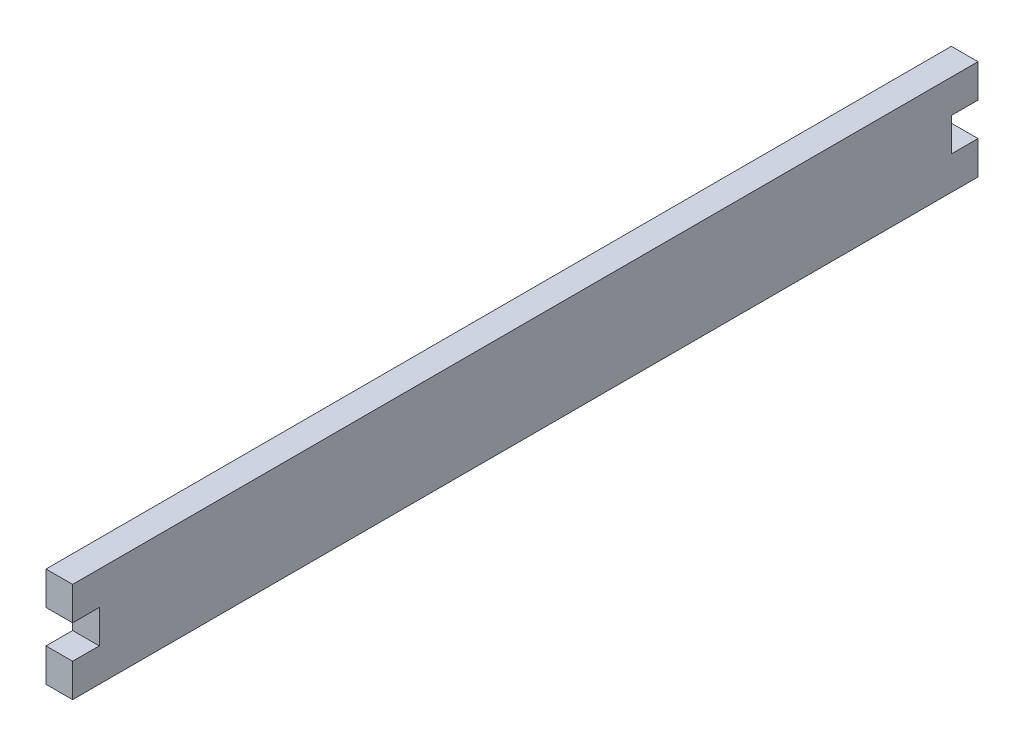
ISO-10303-21;
HEADER;
FILE_DESCRIPTION(('STEP AP214'),'2;1');
FILE_NAME('part.step','',(''),(''),'','','');
FILE_SCHEMA(('AUTOMOTIVE_DESIGN { 1 0 10303 214 1 1 1 1 }'));
ENDSEC;
DATA;
#1=APPLICATION_CONTEXT('core data for automotive mechanical design processes');
#2=APPLICATION_PROTOCOL_DEFINITION('international standard','automotive_design',2000,#1);
#3=PRODUCT_CONTEXT('',#1,'mechanical');
#4=PRODUCT('Part','Part','',(#3));
#5=PRODUCT_RELATED_PRODUCT_CATEGORY('part','',(#4));
#6=PRODUCT_DEFINITION_FORMATION('','',#4);
#7=PRODUCT_DEFINITION_CONTEXT('part definition',#1,'design');
#8=PRODUCT_DEFINITION('design','',#6,#7);
#9=PRODUCT_DEFINITION_SHAPE('','',#8);
#10=(LENGTH_UNIT() NAMED_UNIT(*) SI_UNIT(.MILLI.,.METRE.));
#11=(NAMED_UNIT(*) PLANE_ANGLE_UNIT() SI_UNIT($,.RADIAN.));
#12=(NAMED_UNIT(*) SI_UNIT($,.STERADIAN.) SOLID_ANGLE_UNIT());
#13=UNCERTAINTY_MEASURE_WITH_UNIT(LENGTH_MEASURE(1.E-05),#10,'distance_accuracy_value','');
#14=(GEOMETRIC_REPRESENTATION_CONTEXT(3) GLOBAL_UNCERTAINTY_ASSIGNED_CONTEXT((#13)) GLOBAL_UNIT_ASSIGNED_CONTEXT((#10,
#11,#12)) REPRESENTATION_CONTEXT('',''));
#15=CARTESIAN_POINT('',(0.,0.,0.));
#16=DIRECTION('',(0.,0.,1.));
#17=DIRECTION('',(1.,0.,0.));
#18=AXIS2_PLACEMENT_3D('',#15,#16,#17);
#19=CARTESIAN_POINT('',(3.175,0.,0.));
#20=DIRECTION('',(0.,0.,-1.));
#21=DIRECTION('',(-1.,0.,0.));
#22=AXIS2_PLACEMENT_3D('',#19,#20,#21);
#23=PLANE('',#22);
#24=DIRECTION('',(0.,-1.,0.));
#25=VECTOR('',#24,1.);
#26=CARTESIAN_POINT('',(0.,0.,0.));
#27=LINE('',#26,#25);
#28=CARTESIAN_POINT('',(0.,3.96875,0.));
#29=VERTEX_POINT('',#28);
#30=CARTESIAN_POINT('',(0.,0.,0.));
#31=VERTEX_POINT('',#30);
#32=EDGE_CURVE('E153',#29,#31,#27,.T.);
#33=ORIENTED_EDGE('',*,*,#32,.T.);
#34=DIRECTION('',(-1.,0.,0.));
#35=VECTOR('',#34,1.);
#36=CARTESIAN_POINT('',(3.175,0.,0.));
#37=LINE('',#36,#35);
#38=CARTESIAN_POINT('',(3.175,0.,0.));
#39=VERTEX_POINT('',#38);
#40=EDGE_CURVE('E11',#39,#31,#37,.T.);
#41=ORIENTED_EDGE('',*,*,#40,.F.);
#42=DIRECTION('',(0.,-1.,0.));
#43=VECTOR('',#42,1.);
#44=CARTESIAN_POINT('',(3.175,0.,0.));
#45=LINE('',#44,#43);
#46=CARTESIAN_POINT('',(3.175,3.96875,0.));
#47=VERTEX_POINT('',#46);
#48=EDGE_CURVE('E175',#47,#39,#45,.T.);
#49=ORIENTED_EDGE('',*,*,#48,.F.);
#50=DIRECTION('',(-1.,0.,0.));
#51=VECTOR('',#50,1.);
#52=CARTESIAN_POINT('',(3.175,3.96875,0.));
#53=LINE('',#52,#51);
#54=EDGE_CURVE('E149',#47,#29,#53,.T.);
#55=ORIENTED_EDGE('',*,*,#54,.T.);
#56=EDGE_LOOP('',(#33,#41,#49,#55));
#57=FACE_BOUND('',#56,.T.);
#58=ADVANCED_FACE('F33',(#57),#23,.F.);
#59=CARTESIAN_POINT('',(3.175,0.,0.));
#60=DIRECTION('',(0.,1.,0.));
#61=DIRECTION('',(0.,0.,1.));
#62=AXIS2_PLACEMENT_3D('',#59,#60,#61);
#63=PLANE('',#62);
#64=DIRECTION('',(0.,0.,-1.));
#65=VECTOR('',#64,1.);
#66=CARTESIAN_POINT('',(0.,0.,0.));
#67=LINE('',#66,#65);
#68=CARTESIAN_POINT('',(0.,0.,-107.95));
#69=VERTEX_POINT('',#68);
#70=EDGE_CURVE('E156',#31,#69,#67,.T.);
#71=ORIENTED_EDGE('',*,*,#70,.T.);
#72=DIRECTION('',(-1.,0.,0.));
#73=VECTOR('',#72,1.);
#74=CARTESIAN_POINT('',(3.175,0.,-107.95));
#75=LINE('',#74,#73);
#76=CARTESIAN_POINT('',(3.175,0.,-107.95));
#77=VERTEX_POINT('',#76);
#78=EDGE_CURVE('E41',#77,#69,#75,.T.);
#79=ORIENTED_EDGE('',*,*,#78,.F.);
#80=DIRECTION('',(0.,0.,-1.));
#81=VECTOR('',#80,1.);
#82=CARTESIAN_POINT('',(3.175,0.,0.));
#83=LINE('',#82,#81);
#84=EDGE_CURVE('E104',#39,#77,#83,.T.);
#85=ORIENTED_EDGE('',*,*,#84,.F.);
#86=ORIENTED_EDGE('',*,*,#40,.T.);
#87=EDGE_LOOP('',(#71,#79,#85,#86));
#88=FACE_BOUND('',#87,.T.);
#89=ADVANCED_FACE('F253',(#88),#63,.F.);
#90=CARTESIAN_POINT('',(3.175,0.,-107.95));
#91=DIRECTION('',(0.,0.,1.));
#92=DIRECTION('',(1.,0.,0.));
#93=AXIS2_PLACEMENT_3D('',#90,#91,#92);
#94=PLANE('',#93);
#95=DIRECTION('',(0.,1.,0.));
#96=VECTOR('',#95,1.);
#97=CARTESIAN_POINT('',(0.,0.,-107.95));
#98=LINE('',#97,#96);
#99=CARTESIAN_POINT('',(0.,3.96875,-107.95));
#100=VERTEX_POINT('',#99);
#101=EDGE_CURVE('E158',#69,#100,#98,.T.);
#102=ORIENTED_EDGE('',*,*,#101,.T.);
#103=DIRECTION('',(-1.,0.,0.));
#104=VECTOR('',#103,1.);
#105=CARTESIAN_POINT('',(3.175,3.96875,-107.95));
#106=LINE('',#105,#104);
#107=CARTESIAN_POINT('',(3.175,3.96875,-107.95));
#108=VERTEX_POINT('',#107);
#109=EDGE_CURVE('E194',#108,#100,#106,.T.);
#110=ORIENTED_EDGE('',*,*,#109,.F.);
#111=DIRECTION('',(0.,1.,0.));
#112=VECTOR('',#111,1.);
#113=CARTESIAN_POINT('',(3.175,0.,-107.95));
#114=LINE('',#113,#112);
#115=EDGE_CURVE('E202',#77,#108,#114,.T.);
#116=ORIENTED_EDGE('',*,*,#115,.F.);
#117=ORIENTED_EDGE('',*,*,#78,.T.);
#118=EDGE_LOOP('',(#102,#110,#116,#117));
#119=FACE_BOUND('',#118,.T.);
#120=ADVANCED_FACE('F200',(#119),#94,.F.);
#121=CARTESIAN_POINT('',(3.175,3.96875,-107.95));
#122=DIRECTION('',(0.,-1.,0.));
#123=DIRECTION('',(0.,0.,-1.));
#124=AXIS2_PLACEMENT_3D('',#121,#122,#123);
#125=PLANE('',#124);
#126=DIRECTION('',(0.,0.,1.));
#127=VECTOR('',#126,1.);
#128=CARTESIAN_POINT('',(0.,3.96875,-107.95));
#129=LINE('',#128,#127);
#130=CARTESIAN_POINT('',(0.,3.96875,-104.775));
#131=VERTEX_POINT('',#130);
#132=EDGE_CURVE('E160',#100,#131,#129,.T.);
#133=ORIENTED_EDGE('',*,*,#132,.T.);
#134=DIRECTION('',(-1.,0.,0.));
#135=VECTOR('',#134,1.);
#136=CARTESIAN_POINT('',(3.175,3.96875,-104.775));
#137=LINE('',#136,#135);
#138=CARTESIAN_POINT('',(3.175,3.96875,-104.775));
#139=VERTEX_POINT('',#138);
#140=EDGE_CURVE('E191',#139,#131,#137,.T.);
#141=ORIENTED_EDGE('',*,*,#140,.F.);
#142=DIRECTION('',(0.,0.,1.));
#143=VECTOR('',#142,1.);
#144=CARTESIAN_POINT('',(3.175,3.96875,-107.95));
#145=LINE('',#144,#143);
#146=EDGE_CURVE('E220',#108,#139,#145,.T.);
#147=ORIENTED_EDGE('',*,*,#146,.F.);
#148=ORIENTED_EDGE('',*,*,#109,.T.);
#149=EDGE_LOOP('',(#133,#141,#147,#148));
#150=FACE_BOUND('',#149,.T.);
#151=ADVANCED_FACE('F211',(#150),#125,.F.);
#152=CARTESIAN_POINT('',(3.175,7.9375,-104.775));
#153=DIRECTION('',(0.,0.,1.));
#154=DIRECTION('',(1.,0.,0.));
#155=AXIS2_PLACEMENT_3D('',#152,#153,#154);
#156=PLANE('',#155);
#157=DIRECTION('',(0.,1.,0.));
#158=VECTOR('',#157,1.);
#159=CARTESIAN_POINT('',(0.,7.9375,-104.775));
#160=LINE('',#159,#158);
#161=CARTESIAN_POINT('',(0.,7.9375,-104.775));
#162=VERTEX_POINT('',#161);
#163=EDGE_CURVE('E162',#131,#162,#160,.T.);
#164=ORIENTED_EDGE('',*,*,#163,.T.);
#165=DIRECTION('',(-1.,0.,0.));
#166=VECTOR('',#165,1.);
#167=CARTESIAN_POINT('',(3.175,7.9375,-104.775));
#168=LINE('',#167,#166);
#169=CARTESIAN_POINT('',(3.175,7.9375,-104.775));
#170=VERTEX_POINT('',#169);
#171=EDGE_CURVE('E188',#170,#162,#168,.T.);
#172=ORIENTED_EDGE('',*,*,#171,.F.);
#173=DIRECTION('',(0.,1.,0.));
#174=VECTOR('',#173,1.);
#175=CARTESIAN_POINT('',(3.175,7.9375,-104.775));
#176=LINE('',#175,#174);
#177=EDGE_CURVE('E217',#139,#170,#176,.T.);
#178=ORIENTED_EDGE('',*,*,#177,.F.);
#179=ORIENTED_EDGE('',*,*,#140,.T.);
#180=EDGE_LOOP('',(#164,#172,#178,#179));
#181=FACE_BOUND('',#180,.T.);
#182=ADVANCED_FACE('F215',(#181),#156,.F.);
#183=CARTESIAN_POINT('',(3.175,7.9375,-107.95));
#184=DIRECTION('',(0.,1.,0.));
#185=DIRECTION('',(0.,0.,1.));
#186=AXIS2_PLACEMENT_3D('',#183,#184,#185);
#187=PLANE('',#186);
#188=DIRECTION('',(0.,0.,-1.));
#189=VECTOR('',#188,1.);
#190=CARTESIAN_POINT('',(0.,7.9375,-107.95));
#191=LINE('',#190,#189);
#192=CARTESIAN_POINT('',(0.,7.9375,-107.95));
#193=VERTEX_POINT('',#192);
#194=EDGE_CURVE('E164',#162,#193,#191,.T.);
#195=ORIENTED_EDGE('',*,*,#194,.T.);
#196=DIRECTION('',(-1.,0.,0.));
#197=VECTOR('',#196,1.);
#198=CARTESIAN_POINT('',(3.175,7.9375,-107.95));
#199=LINE('',#198,#197);
#200=CARTESIAN_POINT('',(3.175,7.9375,-107.95));
#201=VERTEX_POINT('',#200);
#202=EDGE_CURVE('E185',#201,#193,#199,.T.);
#203=ORIENTED_EDGE('',*,*,#202,.F.);
#204=DIRECTION('',(0.,0.,-1.));
#205=VECTOR('',#204,1.);
#206=CARTESIAN_POINT('',(3.175,7.9375,-107.95));
#207=LINE('',#206,#205);
#208=EDGE_CURVE('E219',#170,#201,#207,.T.);
#209=ORIENTED_EDGE('',*,*,#208,.F.);
#210=ORIENTED_EDGE('',*,*,#171,.T.);
#211=EDGE_LOOP('',(#195,#203,#209,#210));
#212=FACE_BOUND('',#211,.T.);
#213=ADVANCED_FACE('F266',(#212),#187,.F.);
#214=CARTESIAN_POINT('',(3.175,7.9375,-107.95));
#215=DIRECTION('',(0.,0.,1.));
#216=DIRECTION('',(1.,0.,0.));
#217=AXIS2_PLACEMENT_3D('',#214,#215,#216);
#218=PLANE('',#217);
#219=DIRECTION('',(0.,1.,0.));
#220=VECTOR('',#219,1.);
#221=CARTESIAN_POINT('',(0.,7.9375,-107.95));
#222=LINE('',#221,#220);
#223=CARTESIAN_POINT('',(0.,11.90625,-107.95));
#224=VERTEX_POINT('',#223);
#225=EDGE_CURVE('E166',#193,#224,#222,.T.);
#226=ORIENTED_EDGE('',*,*,#225,.T.);
#227=DIRECTION('',(-1.,0.,0.));
#228=VECTOR('',#227,1.);
#229=CARTESIAN_POINT('',(3.175,11.90625,-107.95));
#230=LINE('',#229,#228);
#231=CARTESIAN_POINT('',(3.175,11.90625,-107.95));
#232=VERTEX_POINT('',#231);
#233=EDGE_CURVE('E182',#232,#224,#230,.T.);
#234=ORIENTED_EDGE('',*,*,#233,.F.);
#235=DIRECTION('',(0.,1.,0.));
#236=VECTOR('',#235,1.);
#237=CARTESIAN_POINT('',(3.175,7.9375,-107.95));
#238=LINE('',#237,#236);
#239=EDGE_CURVE('E222',#201,#232,#238,.T.);
#240=ORIENTED_EDGE('',*,*,#239,.F.);
#241=ORIENTED_EDGE('',*,*,#202,.T.);
#242=EDGE_LOOP('',(#226,#234,#240,#241));
#243=FACE_BOUND('',#242,.T.);
#244=ADVANCED_FACE('F269',(#243),#218,.F.);
#245=CARTESIAN_POINT('',(3.175,11.90625,0.));
#246=DIRECTION('',(0.,-1.,0.));
#247=DIRECTION('',(0.,0.,-1.));
#248=AXIS2_PLACEMENT_3D('',#245,#246,#247);
#249=PLANE('',#248);
#250=DIRECTION('',(0.,0.,1.));
#251=VECTOR('',#250,1.);
#252=CARTESIAN_POINT('',(0.,11.90625,0.));
#253=LINE('',#252,#251);
#254=CARTESIAN_POINT('',(0.,11.90625,0.));
#255=VERTEX_POINT('',#254);
#256=EDGE_CURVE('E168',#224,#255,#253,.T.);
#257=ORIENTED_EDGE('',*,*,#256,.T.);
#258=DIRECTION('',(-1.,0.,0.));
#259=VECTOR('',#258,1.);
#260=CARTESIAN_POINT('',(3.175,11.90625,0.));
#261=LINE('',#260,#259);
#262=CARTESIAN_POINT('',(3.175,11.90625,0.));
#263=VERTEX_POINT('',#262);
#264=EDGE_CURVE('E179',#263,#255,#261,.T.);
#265=ORIENTED_EDGE('',*,*,#264,.F.);
#266=DIRECTION('',(0.,0.,1.));
#267=VECTOR('',#266,1.);
#268=CARTESIAN_POINT('',(3.175,11.90625,0.));
#269=LINE('',#268,#267);
#270=EDGE_CURVE('E228',#232,#263,#269,.T.);
#271=ORIENTED_EDGE('',*,*,#270,.F.);
#272=ORIENTED_EDGE('',*,*,#233,.T.);
#273=EDGE_LOOP('',(#257,#265,#271,#272));
#274=FACE_BOUND('',#273,.T.);
#275=ADVANCED_FACE('F234',(#274),#249,.F.);
#276=CARTESIAN_POINT('',(3.175,7.9375,0.));
#277=DIRECTION('',(0.,0.,-1.));
#278=DIRECTION('',(-1.,0.,0.));
#279=AXIS2_PLACEMENT_3D('',#276,#277,#278);
#280=PLANE('',#279);
#281=DIRECTION('',(0.,-1.,0.));
#282=VECTOR('',#281,1.);
#283=CARTESIAN_POINT('',(0.,7.9375,0.));
#284=LINE('',#283,#282);
#285=CARTESIAN_POINT('',(0.,7.9375,0.));
#286=VERTEX_POINT('',#285);
#287=EDGE_CURVE('E170',#255,#286,#284,.T.);
#288=ORIENTED_EDGE('',*,*,#287,.T.);
#289=DIRECTION('',(-1.,0.,0.));
#290=VECTOR('',#289,1.);
#291=CARTESIAN_POINT('',(3.175,7.9375,0.));
#292=LINE('',#291,#290);
#293=CARTESIAN_POINT('',(3.175,7.9375,0.));
#294=VERTEX_POINT('',#293);
#295=EDGE_CURVE('E144',#294,#286,#292,.T.);
#296=ORIENTED_EDGE('',*,*,#295,.F.);
#297=DIRECTION('',(0.,-1.,0.));
#298=VECTOR('',#297,1.);
#299=CARTESIAN_POINT('',(3.175,7.9375,0.));
#300=LINE('',#299,#298);
#301=EDGE_CURVE('E135',#263,#294,#300,.T.);
#302=ORIENTED_EDGE('',*,*,#301,.F.);
#303=ORIENTED_EDGE('',*,*,#264,.T.);
#304=EDGE_LOOP('',(#288,#296,#302,#303));
#305=FACE_BOUND('',#304,.T.);
#306=ADVANCED_FACE('F238',(#305),#280,.F.);
#307=CARTESIAN_POINT('',(3.175,7.9375,0.));
#308=DIRECTION('',(0.,1.,0.));
#309=DIRECTION('',(0.,0.,1.));
#310=AXIS2_PLACEMENT_3D('',#307,#308,#309);
#311=PLANE('',#310);
#312=DIRECTION('',(0.,0.,-1.));
#313=VECTOR('',#312,1.);
#314=CARTESIAN_POINT('',(0.,7.9375,0.));
#315=LINE('',#314,#313);
#316=CARTESIAN_POINT('',(0.,7.9375,-3.175));
#317=VERTEX_POINT('',#316);
#318=EDGE_CURVE('E143',#286,#317,#315,.T.);
#319=ORIENTED_EDGE('',*,*,#318,.T.);
#320=DIRECTION('',(-1.,0.,0.));
#321=VECTOR('',#320,1.);
#322=CARTESIAN_POINT('',(3.175,7.9375,-3.175));
#323=LINE('',#322,#321);
#324=CARTESIAN_POINT('',(3.175,7.9375,-3.175));
#325=VERTEX_POINT('',#324);
#326=EDGE_CURVE('E140',#325,#317,#323,.T.);
#327=ORIENTED_EDGE('',*,*,#326,.F.);
#328=DIRECTION('',(0.,0.,-1.));
#329=VECTOR('',#328,1.);
#330=CARTESIAN_POINT('',(3.175,7.9375,0.));
#331=LINE('',#330,#329);
#332=EDGE_CURVE('E129',#294,#325,#331,.T.);
#333=ORIENTED_EDGE('',*,*,#332,.F.);
#334=ORIENTED_EDGE('',*,*,#295,.T.);
#335=EDGE_LOOP('',(#319,#327,#333,#334));
#336=FACE_BOUND('',#335,.T.);
#337=ADVANCED_FACE('F141',(#336),#311,.F.);
#338=CARTESIAN_POINT('',(3.175,7.9375,-3.175));
#339=DIRECTION('',(0.,0.,-1.));
#340=DIRECTION('',(-1.,0.,0.));
#341=AXIS2_PLACEMENT_3D('',#338,#339,#340);
#342=PLANE('',#341);
#343=DIRECTION('',(0.,-1.,0.));
#344=VECTOR('',#343,1.);
#345=CARTESIAN_POINT('',(0.,7.9375,-3.175));
#346=LINE('',#345,#344);
#347=CARTESIAN_POINT('',(0.,3.96875,-3.175));
#348=VERTEX_POINT('',#347);
#349=EDGE_CURVE('E90',#317,#348,#346,.T.);
#350=ORIENTED_EDGE('',*,*,#349,.T.);
#351=DIRECTION('',(-1.,0.,0.));
#352=VECTOR('',#351,1.);
#353=CARTESIAN_POINT('',(3.175,3.96875,-3.175));
#354=LINE('',#353,#352);
#355=CARTESIAN_POINT('',(3.175,3.96875,-3.175));
#356=VERTEX_POINT('',#355);
#357=EDGE_CURVE('E145',#356,#348,#354,.T.);
#358=ORIENTED_EDGE('',*,*,#357,.F.);
#359=DIRECTION('',(0.,-1.,0.));
#360=VECTOR('',#359,1.);
#361=CARTESIAN_POINT('',(3.175,7.9375,-3.175));
#362=LINE('',#361,#360);
#363=EDGE_CURVE('E133',#325,#356,#362,.T.);
#364=ORIENTED_EDGE('',*,*,#363,.F.);
#365=ORIENTED_EDGE('',*,*,#326,.T.);
#366=EDGE_LOOP('',(#350,#358,#364,#365));
#367=FACE_BOUND('',#366,.T.);
#368=ADVANCED_FACE('F147',(#367),#342,.F.);
#369=CARTESIAN_POINT('',(3.175,3.96875,0.));
#370=DIRECTION('',(0.,-1.,0.));
#371=DIRECTION('',(0.,0.,-1.));
#372=AXIS2_PLACEMENT_3D('',#369,#370,#371);
#373=PLANE('',#372);
#374=DIRECTION('',(0.,0.,1.));
#375=VECTOR('',#374,1.);
#376=CARTESIAN_POINT('',(0.,3.96875,0.));
#377=LINE('',#376,#375);
#378=EDGE_CURVE('E96',#348,#29,#377,.T.);
#379=ORIENTED_EDGE('',*,*,#378,.T.);
#380=ORIENTED_EDGE('',*,*,#54,.F.);
#381=DIRECTION('',(0.,0.,1.));
#382=VECTOR('',#381,1.);
#383=CARTESIAN_POINT('',(3.175,3.96875,0.));
#384=LINE('',#383,#382);
#385=EDGE_CURVE('E49',#356,#47,#384,.T.);
#386=ORIENTED_EDGE('',*,*,#385,.F.);
#387=ORIENTED_EDGE('',*,*,#357,.T.);
#388=EDGE_LOOP('',(#379,#380,#386,#387));
#389=FACE_BOUND('',#388,.T.);
#390=ADVANCED_FACE('F242',(#389),#373,.F.);
#391=CARTESIAN_POINT('',(3.175,0.,0.));
#392=DIRECTION('',(-1.,0.,0.));
#393=DIRECTION('',(0.,0.,1.));
#394=AXIS2_PLACEMENT_3D('',#391,#392,#393);
#395=PLANE('',#394);
#396=ORIENTED_EDGE('',*,*,#48,.T.);
#397=ORIENTED_EDGE('',*,*,#84,.T.);
#398=ORIENTED_EDGE('',*,*,#115,.T.);
#399=ORIENTED_EDGE('',*,*,#146,.T.);
#400=ORIENTED_EDGE('',*,*,#177,.T.);
#401=ORIENTED_EDGE('',*,*,#208,.T.);
#402=ORIENTED_EDGE('',*,*,#239,.T.);
#403=ORIENTED_EDGE('',*,*,#270,.T.);
#404=ORIENTED_EDGE('',*,*,#301,.T.);
#405=ORIENTED_EDGE('',*,*,#332,.T.);
#406=ORIENTED_EDGE('',*,*,#363,.T.);
#407=ORIENTED_EDGE('',*,*,#385,.T.);
#408=EDGE_LOOP('',(#396,#397,#398,#399,#400,#401,#402,#403,#404,#405,#406,#407));
#409=FACE_BOUND('',#408,.T.);
#410=ADVANCED_FACE('F131',(#409),#395,.F.);
#411=CARTESIAN_POINT('',(0.,0.,0.));
#412=DIRECTION('',(-1.,0.,0.));
#413=DIRECTION('',(0.,0.,1.));
#414=AXIS2_PLACEMENT_3D('',#411,#412,#413);
#415=PLANE('',#414);
#416=ORIENTED_EDGE('',*,*,#32,.F.);
#417=ORIENTED_EDGE('',*,*,#378,.F.);
#418=ORIENTED_EDGE('',*,*,#349,.F.);
#419=ORIENTED_EDGE('',*,*,#318,.F.);
#420=ORIENTED_EDGE('',*,*,#287,.F.);
#421=ORIENTED_EDGE('',*,*,#256,.F.);
#422=ORIENTED_EDGE('',*,*,#225,.F.);
#423=ORIENTED_EDGE('',*,*,#194,.F.);
#424=ORIENTED_EDGE('',*,*,#163,.F.);
#425=ORIENTED_EDGE('',*,*,#132,.F.);
#426=ORIENTED_EDGE('',*,*,#101,.F.);
#427=ORIENTED_EDGE('',*,*,#70,.F.);
#428=EDGE_LOOP('',(#416,#417,#418,#419,#420,#421,#422,#423,#424,#425,#426,#427));
#429=FACE_BOUND('',#428,.T.);
#430=ADVANCED_FACE('F206',(#429),#415,.T.);
#431=CLOSED_SHELL('',(#58,#89,#120,#151,#182,#213,#244,#275,#306,#337,#368,#390,#410,#430));
#432=MANIFOLD_SOLID_BREP('B2',#431);
#433=ADVANCED_BREP_SHAPE_REPRESENTATION('',(#18,#432),#14);
#434=SHAPE_DEFINITION_REPRESENTATION(#9,#433);
ENDSEC;
END-ISO-10303-21;
